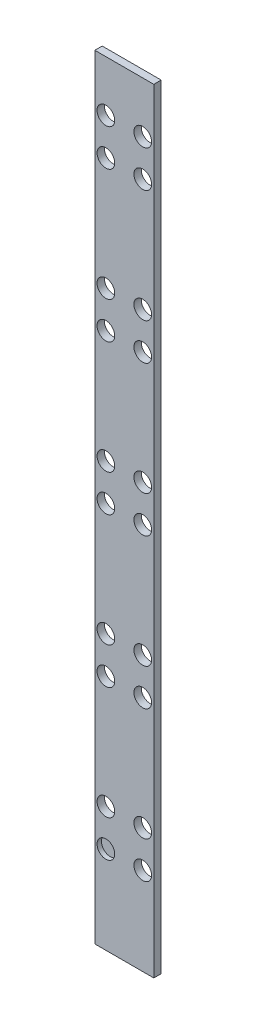
ISO-10303-21;
HEADER;
FILE_DESCRIPTION(('STEP AP214'),'2;1');
FILE_NAME('part.step','',(''),(''),'','','');
FILE_SCHEMA(('AUTOMOTIVE_DESIGN { 1 0 10303 214 1 1 1 1 }'));
ENDSEC;
DATA;
#1=APPLICATION_CONTEXT('core data for automotive mechanical design processes');
#2=APPLICATION_PROTOCOL_DEFINITION('international standard','automotive_design',2000,#1);
#3=PRODUCT_CONTEXT('',#1,'mechanical');
#4=PRODUCT('Part','Part','',(#3));
#5=PRODUCT_RELATED_PRODUCT_CATEGORY('part','',(#4));
#6=PRODUCT_DEFINITION_FORMATION('','',#4);
#7=PRODUCT_DEFINITION_CONTEXT('part definition',#1,'design');
#8=PRODUCT_DEFINITION('design','',#6,#7);
#9=PRODUCT_DEFINITION_SHAPE('','',#8);
#10=(LENGTH_UNIT() NAMED_UNIT(*) SI_UNIT(.MILLI.,.METRE.));
#11=(NAMED_UNIT(*) PLANE_ANGLE_UNIT() SI_UNIT($,.RADIAN.));
#12=(NAMED_UNIT(*) SI_UNIT($,.STERADIAN.) SOLID_ANGLE_UNIT());
#13=UNCERTAINTY_MEASURE_WITH_UNIT(LENGTH_MEASURE(1.E-05),#10,'distance_accuracy_value','');
#14=(GEOMETRIC_REPRESENTATION_CONTEXT(3) GLOBAL_UNCERTAINTY_ASSIGNED_CONTEXT((#13)) GLOBAL_UNIT_ASSIGNED_CONTEXT((#10,
#11,#12)) REPRESENTATION_CONTEXT('',''));
#15=CARTESIAN_POINT('',(0.,0.,0.));
#16=DIRECTION('',(0.,0.,1.));
#17=DIRECTION('',(1.,0.,0.));
#18=AXIS2_PLACEMENT_3D('',#15,#16,#17);
#19=CARTESIAN_POINT('',(2.,-52.5,-0.350000000000001));
#20=DIRECTION('',(0.,0.,-1.));
#21=DIRECTION('',(-1.,0.,0.));
#22=AXIS2_PLACEMENT_3D('',#19,#20,#21);
#23=PLANE('',#22);
#24=CARTESIAN_POINT('',(-1.25,-44.05,-0.35));
#25=DIRECTION('',(0.,0.,1.));
#26=DIRECTION('',(1.,0.,0.));
#27=AXIS2_PLACEMENT_3D('',#24,#25,#26);
#28=CIRCLE('',#27,0.600000000000003);
#29=CARTESIAN_POINT('',(-0.649999999999997,-44.05,-0.35));
#30=VERTEX_POINT('',#29);
#31=EDGE_CURVE('E244',#30,#30,#28,.T.);
#32=ORIENTED_EDGE('',*,*,#31,.T.);
#33=EDGE_LOOP('',(#32));
#34=FACE_BOUND('',#33,.T.);
#35=CARTESIAN_POINT('',(-1.25,-36.4,-0.35));
#36=DIRECTION('',(0.,0.,1.));
#37=DIRECTION('',(1.,0.,0.));
#38=AXIS2_PLACEMENT_3D('',#35,#36,#37);
#39=CIRCLE('',#38,0.600000000000003);
#40=CARTESIAN_POINT('',(-0.649999999999997,-36.4,-0.35));
#41=VERTEX_POINT('',#40);
#42=EDGE_CURVE('E253',#41,#41,#39,.T.);
#43=ORIENTED_EDGE('',*,*,#42,.T.);
#44=EDGE_LOOP('',(#43));
#45=FACE_BOUND('',#44,.T.);
#46=CARTESIAN_POINT('',(-1.25,-33.9,-0.35));
#47=DIRECTION('',(0.,0.,1.));
#48=DIRECTION('',(1.,0.,0.));
#49=AXIS2_PLACEMENT_3D('',#46,#47,#48);
#50=CIRCLE('',#49,0.600000000000003);
#51=CARTESIAN_POINT('',(-0.649999999999997,-33.9,-0.35));
#52=VERTEX_POINT('',#51);
#53=EDGE_CURVE('E261',#52,#52,#50,.T.);
#54=ORIENTED_EDGE('',*,*,#53,.T.);
#55=EDGE_LOOP('',(#54));
#56=FACE_BOUND('',#55,.T.);
#57=CARTESIAN_POINT('',(-1.25,-26.25,-0.35));
#58=DIRECTION('',(0.,0.,1.));
#59=DIRECTION('',(1.,0.,0.));
#60=AXIS2_PLACEMENT_3D('',#57,#58,#59);
#61=CIRCLE('',#60,0.6);
#62=CARTESIAN_POINT('',(-0.65,-26.25,-0.35));
#63=VERTEX_POINT('',#62);
#64=EDGE_CURVE('E269',#63,#63,#61,.T.);
#65=ORIENTED_EDGE('',*,*,#64,.T.);
#66=EDGE_LOOP('',(#65));
#67=FACE_BOUND('',#66,.T.);
#68=CARTESIAN_POINT('',(-1.25,-23.75,-0.35));
#69=DIRECTION('',(0.,0.,1.));
#70=DIRECTION('',(1.,0.,0.));
#71=AXIS2_PLACEMENT_3D('',#68,#69,#70);
#72=CIRCLE('',#71,0.6);
#73=CARTESIAN_POINT('',(-0.65,-23.75,-0.35));
#74=VERTEX_POINT('',#73);
#75=EDGE_CURVE('E277',#74,#74,#72,.T.);
#76=ORIENTED_EDGE('',*,*,#75,.T.);
#77=EDGE_LOOP('',(#76));
#78=FACE_BOUND('',#77,.T.);
#79=CARTESIAN_POINT('',(-1.25,-16.1,-0.35));
#80=DIRECTION('',(0.,0.,1.));
#81=DIRECTION('',(1.,0.,0.));
#82=AXIS2_PLACEMENT_3D('',#79,#80,#81);
#83=CIRCLE('',#82,0.6);
#84=CARTESIAN_POINT('',(-0.65,-16.1,-0.35));
#85=VERTEX_POINT('',#84);
#86=EDGE_CURVE('E285',#85,#85,#83,.T.);
#87=ORIENTED_EDGE('',*,*,#86,.T.);
#88=EDGE_LOOP('',(#87));
#89=FACE_BOUND('',#88,.T.);
#90=CARTESIAN_POINT('',(-1.25,-13.6,-0.35));
#91=DIRECTION('',(0.,0.,1.));
#92=DIRECTION('',(1.,0.,0.));
#93=AXIS2_PLACEMENT_3D('',#90,#91,#92);
#94=CIRCLE('',#93,0.6);
#95=CARTESIAN_POINT('',(-0.65,-13.6,-0.35));
#96=VERTEX_POINT('',#95);
#97=EDGE_CURVE('E293',#96,#96,#94,.T.);
#98=ORIENTED_EDGE('',*,*,#97,.T.);
#99=EDGE_LOOP('',(#98));
#100=FACE_BOUND('',#99,.T.);
#101=CARTESIAN_POINT('',(-1.25,-5.95,-0.35));
#102=DIRECTION('',(0.,0.,1.));
#103=DIRECTION('',(1.,0.,0.));
#104=AXIS2_PLACEMENT_3D('',#101,#102,#103);
#105=CIRCLE('',#104,0.6);
#106=CARTESIAN_POINT('',(-0.65,-5.95,-0.35));
#107=VERTEX_POINT('',#106);
#108=EDGE_CURVE('E301',#107,#107,#105,.T.);
#109=ORIENTED_EDGE('',*,*,#108,.T.);
#110=EDGE_LOOP('',(#109));
#111=FACE_BOUND('',#110,.T.);
#112=CARTESIAN_POINT('',(-1.25,-3.45,-0.35));
#113=DIRECTION('',(0.,0.,1.));
#114=DIRECTION('',(1.,0.,0.));
#115=AXIS2_PLACEMENT_3D('',#112,#113,#114);
#116=CIRCLE('',#115,0.6);
#117=CARTESIAN_POINT('',(-0.65,-3.45,-0.35));
#118=VERTEX_POINT('',#117);
#119=EDGE_CURVE('E309',#118,#118,#116,.T.);
#120=ORIENTED_EDGE('',*,*,#119,.T.);
#121=EDGE_LOOP('',(#120));
#122=FACE_BOUND('',#121,.T.);
#123=CARTESIAN_POINT('',(1.25,-46.55,-0.35));
#124=DIRECTION('',(0.,0.,1.));
#125=DIRECTION('',(1.,0.,0.));
#126=AXIS2_PLACEMENT_3D('',#123,#124,#125);
#127=CIRCLE('',#126,0.600000000000002);
#128=CARTESIAN_POINT('',(1.85,-46.55,-0.35));
#129=VERTEX_POINT('',#128);
#130=EDGE_CURVE('E317',#129,#129,#127,.T.);
#131=ORIENTED_EDGE('',*,*,#130,.T.);
#132=EDGE_LOOP('',(#131));
#133=FACE_BOUND('',#132,.T.);
#134=CARTESIAN_POINT('',(1.25,-44.05,-0.35));
#135=DIRECTION('',(0.,0.,1.));
#136=DIRECTION('',(1.,0.,0.));
#137=AXIS2_PLACEMENT_3D('',#134,#135,#136);
#138=CIRCLE('',#137,0.600000000000002);
#139=CARTESIAN_POINT('',(1.85,-44.05,-0.35));
#140=VERTEX_POINT('',#139);
#141=EDGE_CURVE('E325',#140,#140,#138,.T.);
#142=ORIENTED_EDGE('',*,*,#141,.T.);
#143=EDGE_LOOP('',(#142));
#144=FACE_BOUND('',#143,.T.);
#145=CARTESIAN_POINT('',(1.25,-36.4,-0.35));
#146=DIRECTION('',(0.,0.,1.));
#147=DIRECTION('',(1.,0.,0.));
#148=AXIS2_PLACEMENT_3D('',#145,#146,#147);
#149=CIRCLE('',#148,0.600000000000002);
#150=CARTESIAN_POINT('',(1.85,-36.4,-0.35));
#151=VERTEX_POINT('',#150);
#152=EDGE_CURVE('E333',#151,#151,#149,.T.);
#153=ORIENTED_EDGE('',*,*,#152,.T.);
#154=EDGE_LOOP('',(#153));
#155=FACE_BOUND('',#154,.T.);
#156=CARTESIAN_POINT('',(1.25,-33.9,-0.35));
#157=DIRECTION('',(0.,0.,1.));
#158=DIRECTION('',(1.,0.,0.));
#159=AXIS2_PLACEMENT_3D('',#156,#157,#158);
#160=CIRCLE('',#159,0.600000000000002);
#161=CARTESIAN_POINT('',(1.85,-33.9,-0.35));
#162=VERTEX_POINT('',#161);
#163=EDGE_CURVE('E341',#162,#162,#160,.T.);
#164=ORIENTED_EDGE('',*,*,#163,.T.);
#165=EDGE_LOOP('',(#164));
#166=FACE_BOUND('',#165,.T.);
#167=CARTESIAN_POINT('',(1.25,-26.25,-0.35));
#168=DIRECTION('',(0.,0.,1.));
#169=DIRECTION('',(1.,0.,0.));
#170=AXIS2_PLACEMENT_3D('',#167,#168,#169);
#171=CIRCLE('',#170,0.6);
#172=CARTESIAN_POINT('',(1.85,-26.25,-0.35));
#173=VERTEX_POINT('',#172);
#174=EDGE_CURVE('E349',#173,#173,#171,.T.);
#175=ORIENTED_EDGE('',*,*,#174,.T.);
#176=EDGE_LOOP('',(#175));
#177=FACE_BOUND('',#176,.T.);
#178=CARTESIAN_POINT('',(1.25,-23.75,-0.35));
#179=DIRECTION('',(0.,0.,1.));
#180=DIRECTION('',(1.,0.,0.));
#181=AXIS2_PLACEMENT_3D('',#178,#179,#180);
#182=CIRCLE('',#181,0.6);
#183=CARTESIAN_POINT('',(1.85,-23.75,-0.35));
#184=VERTEX_POINT('',#183);
#185=EDGE_CURVE('E357',#184,#184,#182,.T.);
#186=ORIENTED_EDGE('',*,*,#185,.T.);
#187=EDGE_LOOP('',(#186));
#188=FACE_BOUND('',#187,.T.);
#189=CARTESIAN_POINT('',(1.25,-16.1,-0.35));
#190=DIRECTION('',(0.,0.,1.));
#191=DIRECTION('',(1.,0.,0.));
#192=AXIS2_PLACEMENT_3D('',#189,#190,#191);
#193=CIRCLE('',#192,0.6);
#194=CARTESIAN_POINT('',(1.85,-16.1,-0.35));
#195=VERTEX_POINT('',#194);
#196=EDGE_CURVE('E365',#195,#195,#193,.T.);
#197=ORIENTED_EDGE('',*,*,#196,.T.);
#198=EDGE_LOOP('',(#197));
#199=FACE_BOUND('',#198,.T.);
#200=CARTESIAN_POINT('',(1.25,-13.6,-0.35));
#201=DIRECTION('',(0.,0.,1.));
#202=DIRECTION('',(1.,0.,0.));
#203=AXIS2_PLACEMENT_3D('',#200,#201,#202);
#204=CIRCLE('',#203,0.6);
#205=CARTESIAN_POINT('',(1.85,-13.6,-0.35));
#206=VERTEX_POINT('',#205);
#207=EDGE_CURVE('E373',#206,#206,#204,.T.);
#208=ORIENTED_EDGE('',*,*,#207,.T.);
#209=EDGE_LOOP('',(#208));
#210=FACE_BOUND('',#209,.T.);
#211=CARTESIAN_POINT('',(1.25,-5.95,-0.35));
#212=DIRECTION('',(0.,0.,1.));
#213=DIRECTION('',(1.,0.,0.));
#214=AXIS2_PLACEMENT_3D('',#211,#212,#213);
#215=CIRCLE('',#214,0.6);
#216=CARTESIAN_POINT('',(1.85,-5.95,-0.35));
#217=VERTEX_POINT('',#216);
#218=EDGE_CURVE('E381',#217,#217,#215,.T.);
#219=ORIENTED_EDGE('',*,*,#218,.T.);
#220=EDGE_LOOP('',(#219));
#221=FACE_BOUND('',#220,.T.);
#222=CARTESIAN_POINT('',(1.25,-3.45,-0.35));
#223=DIRECTION('',(0.,0.,1.));
#224=DIRECTION('',(1.,0.,0.));
#225=AXIS2_PLACEMENT_3D('',#222,#223,#224);
#226=CIRCLE('',#225,0.6);
#227=CARTESIAN_POINT('',(1.85,-3.45,-0.35));
#228=VERTEX_POINT('',#227);
#229=EDGE_CURVE('E117',#228,#228,#226,.T.);
#230=ORIENTED_EDGE('',*,*,#229,.T.);
#231=EDGE_LOOP('',(#230));
#232=FACE_BOUND('',#231,.T.);
#233=DIRECTION('',(-1.,0.,0.));
#234=VECTOR('',#233,1.);
#235=CARTESIAN_POINT('',(2.,0.,-0.350000000000001));
#236=LINE('',#235,#234);
#237=CARTESIAN_POINT('',(2.,0.,-0.350000000000001));
#238=VERTEX_POINT('',#237);
#239=CARTESIAN_POINT('',(-2.,0.,-0.35));
#240=VERTEX_POINT('',#239);
#241=EDGE_CURVE('E112',#238,#240,#236,.T.);
#242=ORIENTED_EDGE('',*,*,#241,.F.);
#243=DIRECTION('',(0.,1.,0.));
#244=VECTOR('',#243,1.);
#245=CARTESIAN_POINT('',(2.,-52.5,-0.350000000000001));
#246=LINE('',#245,#244);
#247=CARTESIAN_POINT('',(2.,-52.5,-0.350000000000001));
#248=VERTEX_POINT('',#247);
#249=EDGE_CURVE('E11',#248,#238,#246,.T.);
#250=ORIENTED_EDGE('',*,*,#249,.F.);
#251=DIRECTION('',(-1.,0.,0.));
#252=VECTOR('',#251,1.);
#253=CARTESIAN_POINT('',(2.,-52.5,-0.350000000000001));
#254=LINE('',#253,#252);
#255=CARTESIAN_POINT('',(-2.,-52.5,-0.35));
#256=VERTEX_POINT('',#255);
#257=EDGE_CURVE('E103',#248,#256,#254,.T.);
#258=ORIENTED_EDGE('',*,*,#257,.T.);
#259=DIRECTION('',(0.,1.,0.));
#260=VECTOR('',#259,1.);
#261=CARTESIAN_POINT('',(-2.,-52.5,-0.35));
#262=LINE('',#261,#260);
#263=EDGE_CURVE('E44',#256,#240,#262,.T.);
#264=ORIENTED_EDGE('',*,*,#263,.T.);
#265=EDGE_LOOP('',(#242,#250,#258,#264));
#266=FACE_BOUND('',#265,.T.);
#267=ADVANCED_FACE('F41',(#34,#45,#56,#67,#78,#89,#100,#111,#122,#133,#144,#155,#166,#177,#188,
#199,#210,#221,#232,#266),#23,.T.);
#268=CARTESIAN_POINT('',(2.,-52.5,0.15));
#269=DIRECTION('',(1.,0.,0.));
#270=DIRECTION('',(0.,0.,-1.));
#271=AXIS2_PLACEMENT_3D('',#268,#269,#270);
#272=PLANE('',#271);
#273=DIRECTION('',(0.,0.,-1.));
#274=VECTOR('',#273,1.);
#275=CARTESIAN_POINT('',(2.,0.,0.15));
#276=LINE('',#275,#274);
#277=CARTESIAN_POINT('',(2.,0.,0.15));
#278=VERTEX_POINT('',#277);
#279=EDGE_CURVE('E106',#278,#238,#276,.T.);
#280=ORIENTED_EDGE('',*,*,#279,.F.);
#281=DIRECTION('',(0.,1.,0.));
#282=VECTOR('',#281,1.);
#283=CARTESIAN_POINT('',(2.,-52.5,0.15));
#284=LINE('',#283,#282);
#285=CARTESIAN_POINT('',(2.,-52.5,0.15));
#286=VERTEX_POINT('',#285);
#287=EDGE_CURVE('E51',#286,#278,#284,.T.);
#288=ORIENTED_EDGE('',*,*,#287,.F.);
#289=DIRECTION('',(0.,0.,-1.));
#290=VECTOR('',#289,1.);
#291=CARTESIAN_POINT('',(2.,-52.5,0.15));
#292=LINE('',#291,#290);
#293=EDGE_CURVE('E98',#286,#248,#292,.T.);
#294=ORIENTED_EDGE('',*,*,#293,.T.);
#295=ORIENTED_EDGE('',*,*,#249,.T.);
#296=EDGE_LOOP('',(#280,#288,#294,#295));
#297=FACE_BOUND('',#296,.T.);
#298=ADVANCED_FACE('F129',(#297),#272,.T.);
#299=CARTESIAN_POINT('',(-2.,-52.5,0.15));
#300=DIRECTION('',(0.,0.,1.));
#301=DIRECTION('',(1.,0.,0.));
#302=AXIS2_PLACEMENT_3D('',#299,#300,#301);
#303=PLANE('',#302);
#304=CARTESIAN_POINT('',(-1.25,-46.55,0.15));
#305=DIRECTION('',(0.,0.,1.));
#306=DIRECTION('',(1.,0.,0.));
#307=AXIS2_PLACEMENT_3D('',#304,#305,#306);
#308=CIRCLE('',#307,0.600000000000003);
#309=CARTESIAN_POINT('',(-0.649999999999997,-46.55,0.15));
#310=VERTEX_POINT('',#309);
#311=EDGE_CURVE('E239',#310,#310,#308,.T.);
#312=ORIENTED_EDGE('',*,*,#311,.F.);
#313=EDGE_LOOP('',(#312));
#314=FACE_BOUND('',#313,.T.);
#315=CARTESIAN_POINT('',(-1.25,-44.05,0.15));
#316=DIRECTION('',(0.,0.,1.));
#317=DIRECTION('',(1.,0.,0.));
#318=AXIS2_PLACEMENT_3D('',#315,#316,#317);
#319=CIRCLE('',#318,0.600000000000003);
#320=CARTESIAN_POINT('',(-0.649999999999997,-44.05,0.15));
#321=VERTEX_POINT('',#320);
#322=EDGE_CURVE('E238',#321,#321,#319,.T.);
#323=ORIENTED_EDGE('',*,*,#322,.F.);
#324=EDGE_LOOP('',(#323));
#325=FACE_BOUND('',#324,.T.);
#326=CARTESIAN_POINT('',(-1.25,-36.4,0.15));
#327=DIRECTION('',(0.,0.,1.));
#328=DIRECTION('',(1.,0.,0.));
#329=AXIS2_PLACEMENT_3D('',#326,#327,#328);
#330=CIRCLE('',#329,0.600000000000003);
#331=CARTESIAN_POINT('',(-0.649999999999997,-36.4,0.15));
#332=VERTEX_POINT('',#331);
#333=EDGE_CURVE('E251',#332,#332,#330,.T.);
#334=ORIENTED_EDGE('',*,*,#333,.F.);
#335=EDGE_LOOP('',(#334));
#336=FACE_BOUND('',#335,.T.);
#337=CARTESIAN_POINT('',(-1.25,-33.9,0.15));
#338=DIRECTION('',(0.,0.,1.));
#339=DIRECTION('',(1.,0.,0.));
#340=AXIS2_PLACEMENT_3D('',#337,#338,#339);
#341=CIRCLE('',#340,0.600000000000003);
#342=CARTESIAN_POINT('',(-0.649999999999997,-33.9,0.15));
#343=VERTEX_POINT('',#342);
#344=EDGE_CURVE('E257',#343,#343,#341,.T.);
#345=ORIENTED_EDGE('',*,*,#344,.F.);
#346=EDGE_LOOP('',(#345));
#347=FACE_BOUND('',#346,.T.);
#348=CARTESIAN_POINT('',(-1.25,-26.25,0.15));
#349=DIRECTION('',(0.,0.,1.));
#350=DIRECTION('',(1.,0.,0.));
#351=AXIS2_PLACEMENT_3D('',#348,#349,#350);
#352=CIRCLE('',#351,0.6);
#353=CARTESIAN_POINT('',(-0.65,-26.25,0.15));
#354=VERTEX_POINT('',#353);
#355=EDGE_CURVE('E265',#354,#354,#352,.T.);
#356=ORIENTED_EDGE('',*,*,#355,.F.);
#357=EDGE_LOOP('',(#356));
#358=FACE_BOUND('',#357,.T.);
#359=CARTESIAN_POINT('',(-1.25,-23.75,0.15));
#360=DIRECTION('',(0.,0.,1.));
#361=DIRECTION('',(1.,0.,0.));
#362=AXIS2_PLACEMENT_3D('',#359,#360,#361);
#363=CIRCLE('',#362,0.6);
#364=CARTESIAN_POINT('',(-0.65,-23.75,0.15));
#365=VERTEX_POINT('',#364);
#366=EDGE_CURVE('E273',#365,#365,#363,.T.);
#367=ORIENTED_EDGE('',*,*,#366,.F.);
#368=EDGE_LOOP('',(#367));
#369=FACE_BOUND('',#368,.T.);
#370=CARTESIAN_POINT('',(-1.25,-16.1,0.15));
#371=DIRECTION('',(0.,0.,1.));
#372=DIRECTION('',(1.,0.,0.));
#373=AXIS2_PLACEMENT_3D('',#370,#371,#372);
#374=CIRCLE('',#373,0.6);
#375=CARTESIAN_POINT('',(-0.65,-16.1,0.15));
#376=VERTEX_POINT('',#375);
#377=EDGE_CURVE('E281',#376,#376,#374,.T.);
#378=ORIENTED_EDGE('',*,*,#377,.F.);
#379=EDGE_LOOP('',(#378));
#380=FACE_BOUND('',#379,.T.);
#381=CARTESIAN_POINT('',(-1.25,-13.6,0.15));
#382=DIRECTION('',(0.,0.,1.));
#383=DIRECTION('',(1.,0.,0.));
#384=AXIS2_PLACEMENT_3D('',#381,#382,#383);
#385=CIRCLE('',#384,0.6);
#386=CARTESIAN_POINT('',(-0.65,-13.6,0.15));
#387=VERTEX_POINT('',#386);
#388=EDGE_CURVE('E289',#387,#387,#385,.T.);
#389=ORIENTED_EDGE('',*,*,#388,.F.);
#390=EDGE_LOOP('',(#389));
#391=FACE_BOUND('',#390,.T.);
#392=CARTESIAN_POINT('',(-1.25,-5.95,0.15));
#393=DIRECTION('',(0.,0.,1.));
#394=DIRECTION('',(1.,0.,0.));
#395=AXIS2_PLACEMENT_3D('',#392,#393,#394);
#396=CIRCLE('',#395,0.6);
#397=CARTESIAN_POINT('',(-0.65,-5.95,0.15));
#398=VERTEX_POINT('',#397);
#399=EDGE_CURVE('E297',#398,#398,#396,.T.);
#400=ORIENTED_EDGE('',*,*,#399,.F.);
#401=EDGE_LOOP('',(#400));
#402=FACE_BOUND('',#401,.T.);
#403=CARTESIAN_POINT('',(-1.25,-3.45,0.15));
#404=DIRECTION('',(0.,0.,1.));
#405=DIRECTION('',(1.,0.,0.));
#406=AXIS2_PLACEMENT_3D('',#403,#404,#405);
#407=CIRCLE('',#406,0.6);
#408=CARTESIAN_POINT('',(-0.65,-3.45,0.15));
#409=VERTEX_POINT('',#408);
#410=EDGE_CURVE('E305',#409,#409,#407,.T.);
#411=ORIENTED_EDGE('',*,*,#410,.F.);
#412=EDGE_LOOP('',(#411));
#413=FACE_BOUND('',#412,.T.);
#414=CARTESIAN_POINT('',(1.25,-46.55,0.15));
#415=DIRECTION('',(0.,0.,1.));
#416=DIRECTION('',(1.,0.,0.));
#417=AXIS2_PLACEMENT_3D('',#414,#415,#416);
#418=CIRCLE('',#417,0.600000000000002);
#419=CARTESIAN_POINT('',(1.85,-46.55,0.15));
#420=VERTEX_POINT('',#419);
#421=EDGE_CURVE('E313',#420,#420,#418,.T.);
#422=ORIENTED_EDGE('',*,*,#421,.F.);
#423=EDGE_LOOP('',(#422));
#424=FACE_BOUND('',#423,.T.);
#425=CARTESIAN_POINT('',(1.25,-44.05,0.15));
#426=DIRECTION('',(0.,0.,1.));
#427=DIRECTION('',(1.,0.,0.));
#428=AXIS2_PLACEMENT_3D('',#425,#426,#427);
#429=CIRCLE('',#428,0.600000000000002);
#430=CARTESIAN_POINT('',(1.85,-44.05,0.15));
#431=VERTEX_POINT('',#430);
#432=EDGE_CURVE('E321',#431,#431,#429,.T.);
#433=ORIENTED_EDGE('',*,*,#432,.F.);
#434=EDGE_LOOP('',(#433));
#435=FACE_BOUND('',#434,.T.);
#436=CARTESIAN_POINT('',(1.25,-36.4,0.15));
#437=DIRECTION('',(0.,0.,1.));
#438=DIRECTION('',(1.,0.,0.));
#439=AXIS2_PLACEMENT_3D('',#436,#437,#438);
#440=CIRCLE('',#439,0.600000000000002);
#441=CARTESIAN_POINT('',(1.85,-36.4,0.15));
#442=VERTEX_POINT('',#441);
#443=EDGE_CURVE('E329',#442,#442,#440,.T.);
#444=ORIENTED_EDGE('',*,*,#443,.F.);
#445=EDGE_LOOP('',(#444));
#446=FACE_BOUND('',#445,.T.);
#447=CARTESIAN_POINT('',(1.25,-33.9,0.15));
#448=DIRECTION('',(0.,0.,1.));
#449=DIRECTION('',(1.,0.,0.));
#450=AXIS2_PLACEMENT_3D('',#447,#448,#449);
#451=CIRCLE('',#450,0.600000000000002);
#452=CARTESIAN_POINT('',(1.85,-33.9,0.15));
#453=VERTEX_POINT('',#452);
#454=EDGE_CURVE('E337',#453,#453,#451,.T.);
#455=ORIENTED_EDGE('',*,*,#454,.F.);
#456=EDGE_LOOP('',(#455));
#457=FACE_BOUND('',#456,.T.);
#458=CARTESIAN_POINT('',(1.25,-26.25,0.15));
#459=DIRECTION('',(0.,0.,1.));
#460=DIRECTION('',(1.,0.,0.));
#461=AXIS2_PLACEMENT_3D('',#458,#459,#460);
#462=CIRCLE('',#461,0.6);
#463=CARTESIAN_POINT('',(1.85,-26.25,0.15));
#464=VERTEX_POINT('',#463);
#465=EDGE_CURVE('E345',#464,#464,#462,.T.);
#466=ORIENTED_EDGE('',*,*,#465,.F.);
#467=EDGE_LOOP('',(#466));
#468=FACE_BOUND('',#467,.T.);
#469=CARTESIAN_POINT('',(1.25,-23.75,0.15));
#470=DIRECTION('',(0.,0.,1.));
#471=DIRECTION('',(1.,0.,0.));
#472=AXIS2_PLACEMENT_3D('',#469,#470,#471);
#473=CIRCLE('',#472,0.6);
#474=CARTESIAN_POINT('',(1.85,-23.75,0.15));
#475=VERTEX_POINT('',#474);
#476=EDGE_CURVE('E353',#475,#475,#473,.T.);
#477=ORIENTED_EDGE('',*,*,#476,.F.);
#478=EDGE_LOOP('',(#477));
#479=FACE_BOUND('',#478,.T.);
#480=CARTESIAN_POINT('',(1.25,-16.1,0.15));
#481=DIRECTION('',(0.,0.,1.));
#482=DIRECTION('',(1.,0.,0.));
#483=AXIS2_PLACEMENT_3D('',#480,#481,#482);
#484=CIRCLE('',#483,0.6);
#485=CARTESIAN_POINT('',(1.85,-16.1,0.15));
#486=VERTEX_POINT('',#485);
#487=EDGE_CURVE('E361',#486,#486,#484,.T.);
#488=ORIENTED_EDGE('',*,*,#487,.F.);
#489=EDGE_LOOP('',(#488));
#490=FACE_BOUND('',#489,.T.);
#491=CARTESIAN_POINT('',(1.25,-13.6,0.15));
#492=DIRECTION('',(0.,0.,1.));
#493=DIRECTION('',(1.,0.,0.));
#494=AXIS2_PLACEMENT_3D('',#491,#492,#493);
#495=CIRCLE('',#494,0.6);
#496=CARTESIAN_POINT('',(1.85,-13.6,0.15));
#497=VERTEX_POINT('',#496);
#498=EDGE_CURVE('E369',#497,#497,#495,.T.);
#499=ORIENTED_EDGE('',*,*,#498,.F.);
#500=EDGE_LOOP('',(#499));
#501=FACE_BOUND('',#500,.T.);
#502=CARTESIAN_POINT('',(1.25,-5.95,0.15));
#503=DIRECTION('',(0.,0.,1.));
#504=DIRECTION('',(1.,0.,0.));
#505=AXIS2_PLACEMENT_3D('',#502,#503,#504);
#506=CIRCLE('',#505,0.6);
#507=CARTESIAN_POINT('',(1.85,-5.95,0.15));
#508=VERTEX_POINT('',#507);
#509=EDGE_CURVE('E377',#508,#508,#506,.T.);
#510=ORIENTED_EDGE('',*,*,#509,.F.);
#511=EDGE_LOOP('',(#510));
#512=FACE_BOUND('',#511,.T.);
#513=CARTESIAN_POINT('',(1.25,-3.45,0.15));
#514=DIRECTION('',(0.,0.,1.));
#515=DIRECTION('',(1.,0.,0.));
#516=AXIS2_PLACEMENT_3D('',#513,#514,#515);
#517=CIRCLE('',#516,0.6);
#518=CARTESIAN_POINT('',(1.85,-3.45,0.15));
#519=VERTEX_POINT('',#518);
#520=EDGE_CURVE('E385',#519,#519,#517,.T.);
#521=ORIENTED_EDGE('',*,*,#520,.F.);
#522=EDGE_LOOP('',(#521));
#523=FACE_BOUND('',#522,.T.);
#524=DIRECTION('',(1.,0.,0.));
#525=VECTOR('',#524,1.);
#526=CARTESIAN_POINT('',(-2.,0.,0.15));
#527=LINE('',#526,#525);
#528=CARTESIAN_POINT('',(-2.,0.,0.15));
#529=VERTEX_POINT('',#528);
#530=EDGE_CURVE('E92',#529,#278,#527,.T.);
#531=ORIENTED_EDGE('',*,*,#530,.F.);
#532=DIRECTION('',(0.,1.,0.));
#533=VECTOR('',#532,1.);
#534=CARTESIAN_POINT('',(-2.,-52.5,0.15));
#535=LINE('',#534,#533);
#536=CARTESIAN_POINT('',(-2.,-52.5,0.15));
#537=VERTEX_POINT('',#536);
#538=EDGE_CURVE('E87',#537,#529,#535,.T.);
#539=ORIENTED_EDGE('',*,*,#538,.F.);
#540=DIRECTION('',(1.,0.,0.));
#541=VECTOR('',#540,1.);
#542=CARTESIAN_POINT('',(-2.,-52.5,0.15));
#543=LINE('',#542,#541);
#544=EDGE_CURVE('E90',#537,#286,#543,.T.);
#545=ORIENTED_EDGE('',*,*,#544,.T.);
#546=ORIENTED_EDGE('',*,*,#287,.T.);
#547=EDGE_LOOP('',(#531,#539,#545,#546));
#548=FACE_BOUND('',#547,.T.);
#549=ADVANCED_FACE('F89',(#314,#325,#336,#347,#358,#369,#380,#391,#402,#413,#424,#435,#446,#457,
#468,#479,#490,#501,#512,#523,#548),#303,.T.);
#550=CARTESIAN_POINT('',(-2.,-52.5,-0.35));
#551=DIRECTION('',(-1.,0.,0.));
#552=DIRECTION('',(0.,0.,1.));
#553=AXIS2_PLACEMENT_3D('',#550,#551,#552);
#554=PLANE('',#553);
#555=DIRECTION('',(0.,0.,1.));
#556=VECTOR('',#555,1.);
#557=CARTESIAN_POINT('',(-2.,0.,-0.35));
#558=LINE('',#557,#556);
#559=EDGE_CURVE('E116',#240,#529,#558,.T.);
#560=ORIENTED_EDGE('',*,*,#559,.F.);
#561=ORIENTED_EDGE('',*,*,#263,.F.);
#562=DIRECTION('',(0.,0.,1.));
#563=VECTOR('',#562,1.);
#564=CARTESIAN_POINT('',(-2.,-52.5,-0.35));
#565=LINE('',#564,#563);
#566=EDGE_CURVE('E97',#256,#537,#565,.T.);
#567=ORIENTED_EDGE('',*,*,#566,.T.);
#568=ORIENTED_EDGE('',*,*,#538,.T.);
#569=EDGE_LOOP('',(#560,#561,#567,#568));
#570=FACE_BOUND('',#569,.T.);
#571=ADVANCED_FACE('F101',(#570),#554,.T.);
#572=CARTESIAN_POINT('',(0.,-52.5,0.));
#573=DIRECTION('',(0.,1.,0.));
#574=DIRECTION('',(0.,0.,1.));
#575=AXIS2_PLACEMENT_3D('',#572,#573,#574);
#576=PLANE('',#575);
#577=ORIENTED_EDGE('',*,*,#257,.F.);
#578=ORIENTED_EDGE('',*,*,#293,.F.);
#579=ORIENTED_EDGE('',*,*,#544,.F.);
#580=ORIENTED_EDGE('',*,*,#566,.F.);
#581=EDGE_LOOP('',(#577,#578,#579,#580));
#582=FACE_BOUND('',#581,.T.);
#583=ADVANCED_FACE('F96',(#582),#576,.F.);
#584=CARTESIAN_POINT('',(0.,0.,0.));
#585=DIRECTION('',(0.,1.,0.));
#586=DIRECTION('',(0.,0.,1.));
#587=AXIS2_PLACEMENT_3D('',#584,#585,#586);
#588=PLANE('',#587);
#589=ORIENTED_EDGE('',*,*,#241,.T.);
#590=ORIENTED_EDGE('',*,*,#559,.T.);
#591=ORIENTED_EDGE('',*,*,#530,.T.);
#592=ORIENTED_EDGE('',*,*,#279,.T.);
#593=EDGE_LOOP('',(#589,#590,#591,#592));
#594=FACE_BOUND('',#593,.T.);
#595=ADVANCED_FACE('F128',(#594),#588,.T.);
#596=CARTESIAN_POINT('',(1.25,-3.45,-0.35));
#597=DIRECTION('',(0.,0.,1.));
#598=DIRECTION('',(1.,0.,0.));
#599=AXIS2_PLACEMENT_3D('',#596,#597,#598);
#600=CYLINDRICAL_SURFACE('',#599,0.6);
#601=ORIENTED_EDGE('',*,*,#229,.F.);
#602=EDGE_LOOP('',(#601));
#603=FACE_BOUND('',#602,.T.);
#604=ORIENTED_EDGE('',*,*,#520,.T.);
#605=EDGE_LOOP('',(#604));
#606=FACE_BOUND('',#605,.T.);
#607=ADVANCED_FACE('F148',(#603,#606),#600,.F.);
#608=CARTESIAN_POINT('',(1.25,-5.95,-0.35));
#609=DIRECTION('',(0.,0.,1.));
#610=DIRECTION('',(1.,0.,0.));
#611=AXIS2_PLACEMENT_3D('',#608,#609,#610);
#612=CYLINDRICAL_SURFACE('',#611,0.6);
#613=ORIENTED_EDGE('',*,*,#218,.F.);
#614=EDGE_LOOP('',(#613));
#615=FACE_BOUND('',#614,.T.);
#616=ORIENTED_EDGE('',*,*,#509,.T.);
#617=EDGE_LOOP('',(#616));
#618=FACE_BOUND('',#617,.T.);
#619=ADVANCED_FACE('F152',(#615,#618),#612,.F.);
#620=CARTESIAN_POINT('',(1.25,-13.6,-0.35));
#621=DIRECTION('',(0.,0.,1.));
#622=DIRECTION('',(1.,0.,0.));
#623=AXIS2_PLACEMENT_3D('',#620,#621,#622);
#624=CYLINDRICAL_SURFACE('',#623,0.6);
#625=ORIENTED_EDGE('',*,*,#207,.F.);
#626=EDGE_LOOP('',(#625));
#627=FACE_BOUND('',#626,.T.);
#628=ORIENTED_EDGE('',*,*,#498,.T.);
#629=EDGE_LOOP('',(#628));
#630=FACE_BOUND('',#629,.T.);
#631=ADVANCED_FACE('F156',(#627,#630),#624,.F.);
#632=CARTESIAN_POINT('',(1.25,-16.1,-0.35));
#633=DIRECTION('',(0.,0.,1.));
#634=DIRECTION('',(1.,0.,0.));
#635=AXIS2_PLACEMENT_3D('',#632,#633,#634);
#636=CYLINDRICAL_SURFACE('',#635,0.6);
#637=ORIENTED_EDGE('',*,*,#196,.F.);
#638=EDGE_LOOP('',(#637));
#639=FACE_BOUND('',#638,.T.);
#640=ORIENTED_EDGE('',*,*,#487,.T.);
#641=EDGE_LOOP('',(#640));
#642=FACE_BOUND('',#641,.T.);
#643=ADVANCED_FACE('F160',(#639,#642),#636,.F.);
#644=CARTESIAN_POINT('',(1.25,-23.75,-0.35));
#645=DIRECTION('',(0.,0.,1.));
#646=DIRECTION('',(1.,0.,0.));
#647=AXIS2_PLACEMENT_3D('',#644,#645,#646);
#648=CYLINDRICAL_SURFACE('',#647,0.6);
#649=ORIENTED_EDGE('',*,*,#185,.F.);
#650=EDGE_LOOP('',(#649));
#651=FACE_BOUND('',#650,.T.);
#652=ORIENTED_EDGE('',*,*,#476,.T.);
#653=EDGE_LOOP('',(#652));
#654=FACE_BOUND('',#653,.T.);
#655=ADVANCED_FACE('F164',(#651,#654),#648,.F.);
#656=CARTESIAN_POINT('',(1.25,-26.25,-0.35));
#657=DIRECTION('',(0.,0.,1.));
#658=DIRECTION('',(1.,0.,0.));
#659=AXIS2_PLACEMENT_3D('',#656,#657,#658);
#660=CYLINDRICAL_SURFACE('',#659,0.6);
#661=ORIENTED_EDGE('',*,*,#174,.F.);
#662=EDGE_LOOP('',(#661));
#663=FACE_BOUND('',#662,.T.);
#664=ORIENTED_EDGE('',*,*,#465,.T.);
#665=EDGE_LOOP('',(#664));
#666=FACE_BOUND('',#665,.T.);
#667=ADVANCED_FACE('F168',(#663,#666),#660,.F.);
#668=CARTESIAN_POINT('',(1.25,-33.9,-0.35));
#669=DIRECTION('',(0.,0.,1.));
#670=DIRECTION('',(1.,0.,0.));
#671=AXIS2_PLACEMENT_3D('',#668,#669,#670);
#672=CYLINDRICAL_SURFACE('',#671,0.600000000000002);
#673=ORIENTED_EDGE('',*,*,#163,.F.);
#674=EDGE_LOOP('',(#673));
#675=FACE_BOUND('',#674,.T.);
#676=ORIENTED_EDGE('',*,*,#454,.T.);
#677=EDGE_LOOP('',(#676));
#678=FACE_BOUND('',#677,.T.);
#679=ADVANCED_FACE('F172',(#675,#678),#672,.F.);
#680=CARTESIAN_POINT('',(1.25,-36.4,-0.35));
#681=DIRECTION('',(0.,0.,1.));
#682=DIRECTION('',(1.,0.,0.));
#683=AXIS2_PLACEMENT_3D('',#680,#681,#682);
#684=CYLINDRICAL_SURFACE('',#683,0.600000000000002);
#685=ORIENTED_EDGE('',*,*,#152,.F.);
#686=EDGE_LOOP('',(#685));
#687=FACE_BOUND('',#686,.T.);
#688=ORIENTED_EDGE('',*,*,#443,.T.);
#689=EDGE_LOOP('',(#688));
#690=FACE_BOUND('',#689,.T.);
#691=ADVANCED_FACE('F176',(#687,#690),#684,.F.);
#692=CARTESIAN_POINT('',(1.25,-44.05,-0.35));
#693=DIRECTION('',(0.,0.,1.));
#694=DIRECTION('',(1.,0.,0.));
#695=AXIS2_PLACEMENT_3D('',#692,#693,#694);
#696=CYLINDRICAL_SURFACE('',#695,0.600000000000002);
#697=ORIENTED_EDGE('',*,*,#141,.F.);
#698=EDGE_LOOP('',(#697));
#699=FACE_BOUND('',#698,.T.);
#700=ORIENTED_EDGE('',*,*,#432,.T.);
#701=EDGE_LOOP('',(#700));
#702=FACE_BOUND('',#701,.T.);
#703=ADVANCED_FACE('F180',(#699,#702),#696,.F.);
#704=CARTESIAN_POINT('',(1.25,-46.55,-0.35));
#705=DIRECTION('',(0.,0.,1.));
#706=DIRECTION('',(1.,0.,0.));
#707=AXIS2_PLACEMENT_3D('',#704,#705,#706);
#708=CYLINDRICAL_SURFACE('',#707,0.600000000000002);
#709=ORIENTED_EDGE('',*,*,#130,.F.);
#710=EDGE_LOOP('',(#709));
#711=FACE_BOUND('',#710,.T.);
#712=ORIENTED_EDGE('',*,*,#421,.T.);
#713=EDGE_LOOP('',(#712));
#714=FACE_BOUND('',#713,.T.);
#715=ADVANCED_FACE('F184',(#711,#714),#708,.F.);
#716=CARTESIAN_POINT('',(-1.25,-3.45,-0.35));
#717=DIRECTION('',(0.,0.,1.));
#718=DIRECTION('',(1.,0.,0.));
#719=AXIS2_PLACEMENT_3D('',#716,#717,#718);
#720=CYLINDRICAL_SURFACE('',#719,0.6);
#721=ORIENTED_EDGE('',*,*,#119,.F.);
#722=EDGE_LOOP('',(#721));
#723=FACE_BOUND('',#722,.T.);
#724=ORIENTED_EDGE('',*,*,#410,.T.);
#725=EDGE_LOOP('',(#724));
#726=FACE_BOUND('',#725,.T.);
#727=ADVANCED_FACE('F188',(#723,#726),#720,.F.);
#728=CARTESIAN_POINT('',(-1.25,-5.95,-0.35));
#729=DIRECTION('',(0.,0.,1.));
#730=DIRECTION('',(1.,0.,0.));
#731=AXIS2_PLACEMENT_3D('',#728,#729,#730);
#732=CYLINDRICAL_SURFACE('',#731,0.6);
#733=ORIENTED_EDGE('',*,*,#108,.F.);
#734=EDGE_LOOP('',(#733));
#735=FACE_BOUND('',#734,.T.);
#736=ORIENTED_EDGE('',*,*,#399,.T.);
#737=EDGE_LOOP('',(#736));
#738=FACE_BOUND('',#737,.T.);
#739=ADVANCED_FACE('F192',(#735,#738),#732,.F.);
#740=CARTESIAN_POINT('',(-1.25,-13.6,-0.35));
#741=DIRECTION('',(0.,0.,1.));
#742=DIRECTION('',(1.,0.,0.));
#743=AXIS2_PLACEMENT_3D('',#740,#741,#742);
#744=CYLINDRICAL_SURFACE('',#743,0.6);
#745=ORIENTED_EDGE('',*,*,#97,.F.);
#746=EDGE_LOOP('',(#745));
#747=FACE_BOUND('',#746,.T.);
#748=ORIENTED_EDGE('',*,*,#388,.T.);
#749=EDGE_LOOP('',(#748));
#750=FACE_BOUND('',#749,.T.);
#751=ADVANCED_FACE('F196',(#747,#750),#744,.F.);
#752=CARTESIAN_POINT('',(-1.25,-16.1,-0.35));
#753=DIRECTION('',(0.,0.,1.));
#754=DIRECTION('',(1.,0.,0.));
#755=AXIS2_PLACEMENT_3D('',#752,#753,#754);
#756=CYLINDRICAL_SURFACE('',#755,0.6);
#757=ORIENTED_EDGE('',*,*,#86,.F.);
#758=EDGE_LOOP('',(#757));
#759=FACE_BOUND('',#758,.T.);
#760=ORIENTED_EDGE('',*,*,#377,.T.);
#761=EDGE_LOOP('',(#760));
#762=FACE_BOUND('',#761,.T.);
#763=ADVANCED_FACE('F200',(#759,#762),#756,.F.);
#764=CARTESIAN_POINT('',(-1.25,-23.75,-0.35));
#765=DIRECTION('',(0.,0.,1.));
#766=DIRECTION('',(1.,0.,0.));
#767=AXIS2_PLACEMENT_3D('',#764,#765,#766);
#768=CYLINDRICAL_SURFACE('',#767,0.6);
#769=ORIENTED_EDGE('',*,*,#75,.F.);
#770=EDGE_LOOP('',(#769));
#771=FACE_BOUND('',#770,.T.);
#772=ORIENTED_EDGE('',*,*,#366,.T.);
#773=EDGE_LOOP('',(#772));
#774=FACE_BOUND('',#773,.T.);
#775=ADVANCED_FACE('F204',(#771,#774),#768,.F.);
#776=CARTESIAN_POINT('',(-1.25,-26.25,-0.35));
#777=DIRECTION('',(0.,0.,1.));
#778=DIRECTION('',(1.,0.,0.));
#779=AXIS2_PLACEMENT_3D('',#776,#777,#778);
#780=CYLINDRICAL_SURFACE('',#779,0.6);
#781=ORIENTED_EDGE('',*,*,#64,.F.);
#782=EDGE_LOOP('',(#781));
#783=FACE_BOUND('',#782,.T.);
#784=ORIENTED_EDGE('',*,*,#355,.T.);
#785=EDGE_LOOP('',(#784));
#786=FACE_BOUND('',#785,.T.);
#787=ADVANCED_FACE('F208',(#783,#786),#780,.F.);
#788=CARTESIAN_POINT('',(-1.25,-33.9,-0.35));
#789=DIRECTION('',(0.,0.,1.));
#790=DIRECTION('',(1.,0.,0.));
#791=AXIS2_PLACEMENT_3D('',#788,#789,#790);
#792=CYLINDRICAL_SURFACE('',#791,0.600000000000003);
#793=ORIENTED_EDGE('',*,*,#53,.F.);
#794=EDGE_LOOP('',(#793));
#795=FACE_BOUND('',#794,.T.);
#796=ORIENTED_EDGE('',*,*,#344,.T.);
#797=EDGE_LOOP('',(#796));
#798=FACE_BOUND('',#797,.T.);
#799=ADVANCED_FACE('F212',(#795,#798),#792,.F.);
#800=CARTESIAN_POINT('',(-1.25,-36.4,-0.35));
#801=DIRECTION('',(0.,0.,1.));
#802=DIRECTION('',(1.,0.,0.));
#803=AXIS2_PLACEMENT_3D('',#800,#801,#802);
#804=CYLINDRICAL_SURFACE('',#803,0.600000000000003);
#805=ORIENTED_EDGE('',*,*,#42,.F.);
#806=EDGE_LOOP('',(#805));
#807=FACE_BOUND('',#806,.T.);
#808=ORIENTED_EDGE('',*,*,#333,.T.);
#809=EDGE_LOOP('',(#808));
#810=FACE_BOUND('',#809,.T.);
#811=ADVANCED_FACE('F216',(#807,#810),#804,.F.);
#812=CARTESIAN_POINT('',(-1.25,-44.05,-0.35));
#813=DIRECTION('',(0.,0.,1.));
#814=DIRECTION('',(1.,0.,0.));
#815=AXIS2_PLACEMENT_3D('',#812,#813,#814);
#816=CYLINDRICAL_SURFACE('',#815,0.600000000000003);
#817=ORIENTED_EDGE('',*,*,#31,.F.);
#818=EDGE_LOOP('',(#817));
#819=FACE_BOUND('',#818,.T.);
#820=ORIENTED_EDGE('',*,*,#322,.T.);
#821=EDGE_LOOP('',(#820));
#822=FACE_BOUND('',#821,.T.);
#823=ADVANCED_FACE('F220',(#819,#822),#816,.F.);
#824=CARTESIAN_POINT('',(-1.25,-46.55,-0.15));
#825=DIRECTION('',(0.,0.,1.));
#826=DIRECTION('',(1.,0.,0.));
#827=AXIS2_PLACEMENT_3D('',#824,#825,#826);
#828=CYLINDRICAL_SURFACE('',#827,0.600000000000003);
#829=CARTESIAN_POINT('',(-1.25,-46.55,-0.15));
#830=DIRECTION('',(0.,0.,1.));
#831=DIRECTION('',(1.,0.,0.));
#832=AXIS2_PLACEMENT_3D('',#829,#830,#831);
#833=CIRCLE('',#832,0.600000000000003);
#834=CARTESIAN_POINT('',(-0.649999999999997,-46.55,-0.15));
#835=VERTEX_POINT('',#834);
#836=EDGE_CURVE('E236',#835,#835,#833,.T.);
#837=ORIENTED_EDGE('',*,*,#836,.F.);
#838=EDGE_LOOP('',(#837));
#839=FACE_BOUND('',#838,.T.);
#840=ORIENTED_EDGE('',*,*,#311,.T.);
#841=EDGE_LOOP('',(#840));
#842=FACE_BOUND('',#841,.T.);
#843=ADVANCED_FACE('F224',(#839,#842),#828,.F.);
#844=CARTESIAN_POINT('',(-1.25,-46.55,-0.15));
#845=DIRECTION('',(0.,0.,1.));
#846=DIRECTION('',(1.,0.,0.));
#847=AXIS2_PLACEMENT_3D('',#844,#845,#846);
#848=PLANE('',#847);
#849=ORIENTED_EDGE('',*,*,#836,.T.);
#850=EDGE_LOOP('',(#849));
#851=FACE_BOUND('',#850,.T.);
#852=ADVANCED_FACE('F228',(#851),#848,.T.);
#853=CLOSED_SHELL('',(#267,#298,#549,#571,#583,#595,#607,#619,#631,#643,#655,#667,#679,#691,
#703,#715,#727,#739,#751,#763,#775,#787,#799,#811,#823,#843,#852));
#854=MANIFOLD_SOLID_BREP('B2',#853);
#855=ADVANCED_BREP_SHAPE_REPRESENTATION('',(#18,#854),#14);
#856=SHAPE_DEFINITION_REPRESENTATION(#9,#855);
ENDSEC;
END-ISO-10303-21;
